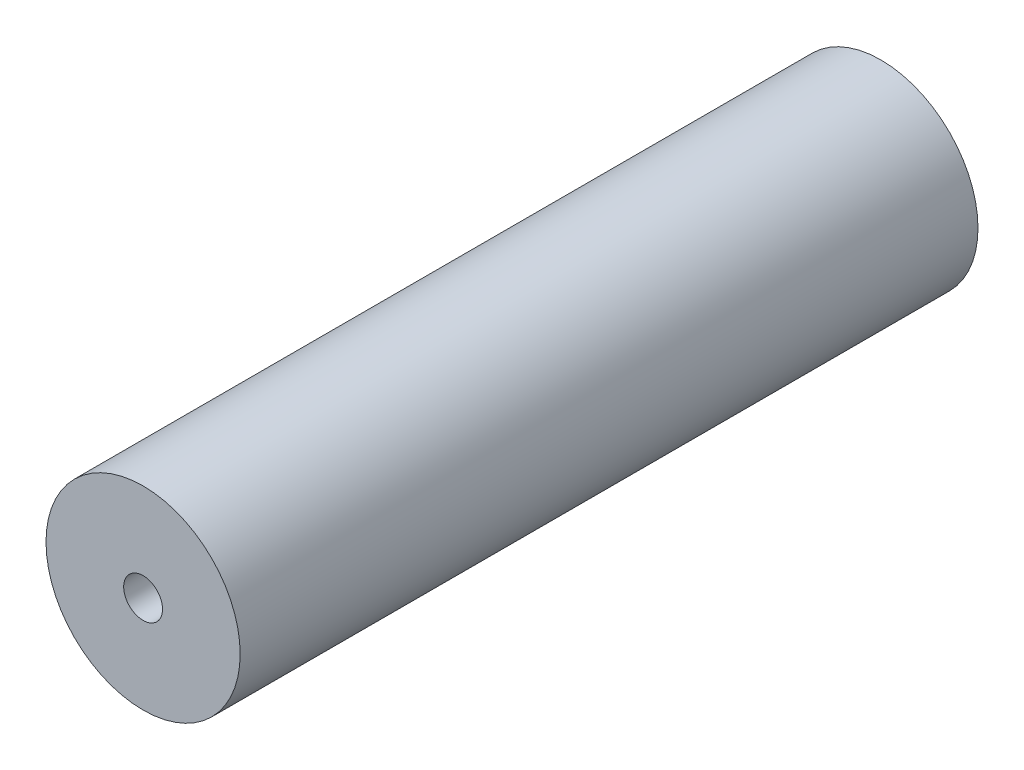
ISO-10303-21;
HEADER;
FILE_DESCRIPTION(('STEP AP214'),'2;1');
FILE_NAME('part.step','',(''),(''),'','','');
FILE_SCHEMA(('AUTOMOTIVE_DESIGN { 1 0 10303 214 1 1 1 1 }'));
ENDSEC;
DATA;
#1=APPLICATION_CONTEXT('core data for automotive mechanical design processes');
#2=APPLICATION_PROTOCOL_DEFINITION('international standard','automotive_design',2000,#1);
#3=PRODUCT_CONTEXT('',#1,'mechanical');
#4=PRODUCT('Part','Part','',(#3));
#5=PRODUCT_RELATED_PRODUCT_CATEGORY('part','',(#4));
#6=PRODUCT_DEFINITION_FORMATION('','',#4);
#7=PRODUCT_DEFINITION_CONTEXT('part definition',#1,'design');
#8=PRODUCT_DEFINITION('design','',#6,#7);
#9=PRODUCT_DEFINITION_SHAPE('','',#8);
#10=(LENGTH_UNIT() NAMED_UNIT(*) SI_UNIT(.MILLI.,.METRE.));
#11=(NAMED_UNIT(*) PLANE_ANGLE_UNIT() SI_UNIT($,.RADIAN.));
#12=(NAMED_UNIT(*) SI_UNIT($,.STERADIAN.) SOLID_ANGLE_UNIT());
#13=UNCERTAINTY_MEASURE_WITH_UNIT(LENGTH_MEASURE(1.E-05),#10,'distance_accuracy_value','');
#14=(GEOMETRIC_REPRESENTATION_CONTEXT(3) GLOBAL_UNCERTAINTY_ASSIGNED_CONTEXT((#13)) GLOBAL_UNIT_ASSIGNED_CONTEXT((#10,
#11,#12)) REPRESENTATION_CONTEXT('',''));
#15=CARTESIAN_POINT('',(0.,0.,0.));
#16=DIRECTION('',(0.,0.,1.));
#17=DIRECTION('',(1.,0.,0.));
#18=AXIS2_PLACEMENT_3D('',#15,#16,#17);
#19=CARTESIAN_POINT('',(0.,0.,190.));
#20=DIRECTION('',(0.,0.,1.));
#21=DIRECTION('',(1.,0.,0.));
#22=AXIS2_PLACEMENT_3D('',#19,#20,#21);
#23=PLANE('',#22);
#24=CARTESIAN_POINT('',(0.,0.,190.));
#25=DIRECTION('',(0.,0.,1.));
#26=DIRECTION('',(1.,0.,0.));
#27=AXIS2_PLACEMENT_3D('',#24,#25,#26);
#28=CIRCLE('',#27,25.);
#29=CARTESIAN_POINT('',(25.,0.,190.));
#30=VERTEX_POINT('',#29);
#31=EDGE_CURVE('E10',#30,#30,#28,.T.);
#32=ORIENTED_EDGE('',*,*,#31,.T.);
#33=EDGE_LOOP('',(#32));
#34=FACE_BOUND('',#33,.T.);
#35=CARTESIAN_POINT('',(0.,0.,190.));
#36=DIRECTION('',(0.,0.,1.));
#37=DIRECTION('',(1.,0.,0.));
#38=AXIS2_PLACEMENT_3D('',#35,#36,#37);
#39=CIRCLE('',#38,5.);
#40=CARTESIAN_POINT('',(5.,0.,190.));
#41=VERTEX_POINT('',#40);
#42=EDGE_CURVE('E47',#41,#41,#39,.T.);
#43=ORIENTED_EDGE('',*,*,#42,.F.);
#44=EDGE_LOOP('',(#43));
#45=FACE_BOUND('',#44,.T.);
#46=ADVANCED_FACE('F36',(#34,#45),#23,.T.);
#47=CARTESIAN_POINT('',(0.,0.,0.));
#48=DIRECTION('',(0.,0.,1.));
#49=DIRECTION('',(1.,0.,0.));
#50=AXIS2_PLACEMENT_3D('',#47,#48,#49);
#51=PLANE('',#50);
#52=CARTESIAN_POINT('',(0.,0.,0.));
#53=DIRECTION('',(0.,0.,1.));
#54=DIRECTION('',(1.,0.,0.));
#55=AXIS2_PLACEMENT_3D('',#52,#53,#54);
#56=CIRCLE('',#55,25.);
#57=CARTESIAN_POINT('',(25.,0.,0.));
#58=VERTEX_POINT('',#57);
#59=EDGE_CURVE('E40',#58,#58,#56,.T.);
#60=ORIENTED_EDGE('',*,*,#59,.F.);
#61=EDGE_LOOP('',(#60));
#62=FACE_BOUND('',#61,.T.);
#63=CARTESIAN_POINT('',(0.,0.,0.));
#64=DIRECTION('',(0.,0.,1.));
#65=DIRECTION('',(1.,0.,0.));
#66=AXIS2_PLACEMENT_3D('',#63,#64,#65);
#67=CIRCLE('',#66,5.);
#68=CARTESIAN_POINT('',(5.,0.,0.));
#69=VERTEX_POINT('',#68);
#70=EDGE_CURVE('E49',#69,#69,#67,.T.);
#71=ORIENTED_EDGE('',*,*,#70,.T.);
#72=EDGE_LOOP('',(#71));
#73=FACE_BOUND('',#72,.T.);
#74=ADVANCED_FACE('F59',(#62,#73),#51,.F.);
#75=CARTESIAN_POINT('',(0.,0.,190.));
#76=DIRECTION('',(0.,0.,-1.));
#77=DIRECTION('',(-1.,0.,0.));
#78=AXIS2_PLACEMENT_3D('',#75,#76,#77);
#79=CYLINDRICAL_SURFACE('',#78,25.);
#80=ORIENTED_EDGE('',*,*,#31,.F.);
#81=EDGE_LOOP('',(#80));
#82=FACE_BOUND('',#81,.T.);
#83=ORIENTED_EDGE('',*,*,#59,.T.);
#84=EDGE_LOOP('',(#83));
#85=FACE_BOUND('',#84,.T.);
#86=ADVANCED_FACE('F38',(#82,#85),#79,.T.);
#87=CARTESIAN_POINT('',(0.,0.,190.));
#88=DIRECTION('',(0.,0.,-1.));
#89=DIRECTION('',(-1.,0.,0.));
#90=AXIS2_PLACEMENT_3D('',#87,#88,#89);
#91=CYLINDRICAL_SURFACE('',#90,5.);
#92=ORIENTED_EDGE('',*,*,#42,.T.);
#93=EDGE_LOOP('',(#92));
#94=FACE_BOUND('',#93,.T.);
#95=ORIENTED_EDGE('',*,*,#70,.F.);
#96=EDGE_LOOP('',(#95));
#97=FACE_BOUND('',#96,.T.);
#98=ADVANCED_FACE('F55',(#94,#97),#91,.F.);
#99=CLOSED_SHELL('',(#46,#74,#86,#98));
#100=MANIFOLD_SOLID_BREP('B2',#99);
#101=ADVANCED_BREP_SHAPE_REPRESENTATION('',(#18,#100),#14);
#102=SHAPE_DEFINITION_REPRESENTATION(#9,#101);
ENDSEC;
END-ISO-10303-21;
